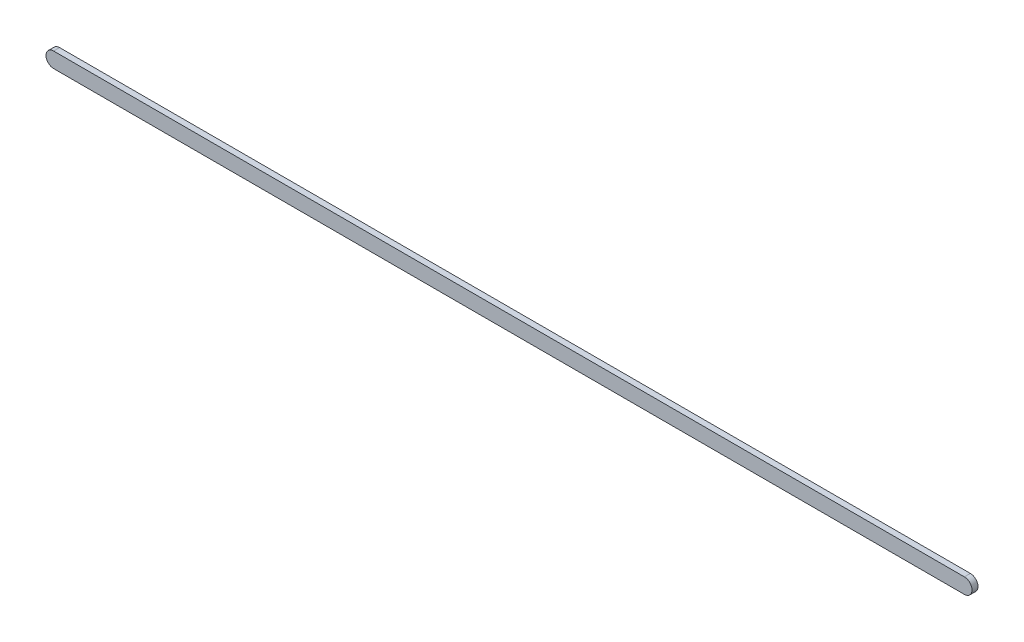
ISO-10303-21;
HEADER;
FILE_DESCRIPTION(('STEP AP214'),'2;1');
FILE_NAME('part.step','',(''),(''),'','','');
FILE_SCHEMA(('AUTOMOTIVE_DESIGN { 1 0 10303 214 1 1 1 1 }'));
ENDSEC;
DATA;
#1=APPLICATION_CONTEXT('core data for automotive mechanical design processes');
#2=APPLICATION_PROTOCOL_DEFINITION('international standard','automotive_design',2000,#1);
#3=PRODUCT_CONTEXT('',#1,'mechanical');
#4=PRODUCT('Part','Part','',(#3));
#5=PRODUCT_RELATED_PRODUCT_CATEGORY('part','',(#4));
#6=PRODUCT_DEFINITION_FORMATION('','',#4);
#7=PRODUCT_DEFINITION_CONTEXT('part definition',#1,'design');
#8=PRODUCT_DEFINITION('design','',#6,#7);
#9=PRODUCT_DEFINITION_SHAPE('','',#8);
#10=(LENGTH_UNIT() NAMED_UNIT(*) SI_UNIT(.MILLI.,.METRE.));
#11=(NAMED_UNIT(*) PLANE_ANGLE_UNIT() SI_UNIT($,.RADIAN.));
#12=(NAMED_UNIT(*) SI_UNIT($,.STERADIAN.) SOLID_ANGLE_UNIT());
#13=UNCERTAINTY_MEASURE_WITH_UNIT(LENGTH_MEASURE(1.E-05),#10,'distance_accuracy_value','');
#14=(GEOMETRIC_REPRESENTATION_CONTEXT(3) GLOBAL_UNCERTAINTY_ASSIGNED_CONTEXT((#13)) GLOBAL_UNIT_ASSIGNED_CONTEXT((#10,
#11,#12)) REPRESENTATION_CONTEXT('',''));
#15=CARTESIAN_POINT('',(0.,0.,0.));
#16=DIRECTION('',(0.,0.,1.));
#17=DIRECTION('',(1.,0.,0.));
#18=AXIS2_PLACEMENT_3D('',#15,#16,#17);
#19=CARTESIAN_POINT('',(105.921302,52.5272,0.));
#20=DIRECTION('',(0.,1.,0.));
#21=DIRECTION('',(1.,0.,0.));
#22=AXIS2_PLACEMENT_3D('',#19,#20,#21);
#23=PLANE('',#22);
#24=DIRECTION('',(1.,0.,0.));
#25=VECTOR('',#24,1.);
#26=CARTESIAN_POINT('',(105.921302,52.5272,0.1999996));
#27=LINE('',#26,#25);
#28=CARTESIAN_POINT('',(105.921302,52.5272,0.1999996));
#29=VERTEX_POINT('',#28);
#30=CARTESIAN_POINT('',(136.3472,52.5272,0.1999996));
#31=VERTEX_POINT('',#30);
#32=EDGE_CURVE('E11',#29,#31,#27,.T.);
#33=ORIENTED_EDGE('',*,*,#32,.F.);
#34=DIRECTION('',(0.,0.,1.));
#35=VECTOR('',#34,1.);
#36=CARTESIAN_POINT('',(105.921302,52.5272,0.));
#37=LINE('',#36,#35);
#38=CARTESIAN_POINT('',(105.921302,52.5272,0.));
#39=VERTEX_POINT('',#38);
#40=EDGE_CURVE('E24',#39,#29,#37,.T.);
#41=ORIENTED_EDGE('',*,*,#40,.F.);
#42=DIRECTION('',(1.,0.,0.));
#43=VECTOR('',#42,1.);
#44=CARTESIAN_POINT('',(105.921302,52.5272,0.));
#45=LINE('',#44,#43);
#46=CARTESIAN_POINT('',(136.3472,52.5272,0.));
#47=VERTEX_POINT('',#46);
#48=EDGE_CURVE('E75',#39,#47,#45,.T.);
#49=ORIENTED_EDGE('',*,*,#48,.T.);
#50=DIRECTION('',(0.,0.,1.));
#51=VECTOR('',#50,1.);
#52=CARTESIAN_POINT('',(136.3472,52.5272,0.));
#53=LINE('',#52,#51);
#54=EDGE_CURVE('E37',#47,#31,#53,.T.);
#55=ORIENTED_EDGE('',*,*,#54,.T.);
#56=EDGE_LOOP('',(#33,#41,#49,#55));
#57=FACE_BOUND('',#56,.T.);
#58=ADVANCED_FACE('F17',(#57),#23,.F.);
#59=CARTESIAN_POINT('',(136.3472,52.7812,0.));
#60=DIRECTION('',(0.,0.,-1.));
#61=DIRECTION('',(-1.11896493820489E-13,-1.,0.));
#62=AXIS2_PLACEMENT_3D('',#59,#60,#61);
#63=CYLINDRICAL_SURFACE('',#62,0.253999999999998);
#64=CARTESIAN_POINT('',(136.3472,52.7812,0.1999996));
#65=DIRECTION('',(0.,0.,1.));
#66=DIRECTION('',(-1.11896493820489E-13,-1.,0.));
#67=AXIS2_PLACEMENT_3D('',#64,#65,#66);
#68=CIRCLE('',#67,0.253999999999998);
#69=CARTESIAN_POINT('',(136.3472,53.0352,0.1999996));
#70=VERTEX_POINT('',#69);
#71=EDGE_CURVE('E83',#31,#70,#68,.T.);
#72=ORIENTED_EDGE('',*,*,#71,.F.);
#73=ORIENTED_EDGE('',*,*,#54,.F.);
#74=CARTESIAN_POINT('',(136.3472,52.7812,0.));
#75=DIRECTION('',(0.,0.,1.));
#76=DIRECTION('',(-1.11896493820489E-13,-1.,0.));
#77=AXIS2_PLACEMENT_3D('',#74,#75,#76);
#78=CIRCLE('',#77,0.253999999999998);
#79=CARTESIAN_POINT('',(136.3472,53.0352,0.));
#80=VERTEX_POINT('',#79);
#81=EDGE_CURVE('E81',#47,#80,#78,.T.);
#82=ORIENTED_EDGE('',*,*,#81,.T.);
#83=DIRECTION('',(0.,0.,1.));
#84=VECTOR('',#83,1.);
#85=CARTESIAN_POINT('',(136.3472,53.0352,0.));
#86=LINE('',#85,#84);
#87=EDGE_CURVE('E67',#80,#70,#86,.T.);
#88=ORIENTED_EDGE('',*,*,#87,.T.);
#89=EDGE_LOOP('',(#72,#73,#82,#88));
#90=FACE_BOUND('',#89,.T.);
#91=ADVANCED_FACE('F89',(#90),#63,.T.);
#92=CARTESIAN_POINT('',(136.3472,53.0352,0.));
#93=DIRECTION('',(0.,-1.,0.));
#94=DIRECTION('',(-1.,0.,0.));
#95=AXIS2_PLACEMENT_3D('',#92,#93,#94);
#96=PLANE('',#95);
#97=DIRECTION('',(-1.,0.,0.));
#98=VECTOR('',#97,1.);
#99=CARTESIAN_POINT('',(136.3472,53.0352,0.1999996));
#100=LINE('',#99,#98);
#101=CARTESIAN_POINT('',(105.921302,53.0352,0.1999996));
#102=VERTEX_POINT('',#101);
#103=EDGE_CURVE('E71',#70,#102,#100,.T.);
#104=ORIENTED_EDGE('',*,*,#103,.F.);
#105=ORIENTED_EDGE('',*,*,#87,.F.);
#106=DIRECTION('',(-1.,0.,0.));
#107=VECTOR('',#106,1.);
#108=CARTESIAN_POINT('',(136.3472,53.0352,0.));
#109=LINE('',#108,#107);
#110=CARTESIAN_POINT('',(105.921302,53.0352,0.));
#111=VERTEX_POINT('',#110);
#112=EDGE_CURVE('E63',#80,#111,#109,.T.);
#113=ORIENTED_EDGE('',*,*,#112,.T.);
#114=DIRECTION('',(0.,0.,1.));
#115=VECTOR('',#114,1.);
#116=CARTESIAN_POINT('',(105.921302,53.0352,0.));
#117=LINE('',#116,#115);
#118=EDGE_CURVE('E53',#111,#102,#117,.T.);
#119=ORIENTED_EDGE('',*,*,#118,.T.);
#120=EDGE_LOOP('',(#104,#105,#113,#119));
#121=FACE_BOUND('',#120,.T.);
#122=ADVANCED_FACE('F66',(#121),#96,.F.);
#123=CARTESIAN_POINT('',(105.921302,52.7812,0.));
#124=DIRECTION('',(0.,0.,-1.));
#125=DIRECTION('',(0.,1.,0.));
#126=AXIS2_PLACEMENT_3D('',#123,#124,#125);
#127=CYLINDRICAL_SURFACE('',#126,0.254000000000003);
#128=CARTESIAN_POINT('',(105.921302,52.7812,0.1999996));
#129=DIRECTION('',(0.,0.,1.));
#130=DIRECTION('',(0.,1.,0.));
#131=AXIS2_PLACEMENT_3D('',#128,#129,#130);
#132=CIRCLE('',#131,0.254000000000003);
#133=EDGE_CURVE('E59',#102,#29,#132,.T.);
#134=ORIENTED_EDGE('',*,*,#133,.F.);
#135=ORIENTED_EDGE('',*,*,#118,.F.);
#136=CARTESIAN_POINT('',(105.921302,52.7812,0.));
#137=DIRECTION('',(0.,0.,1.));
#138=DIRECTION('',(0.,1.,0.));
#139=AXIS2_PLACEMENT_3D('',#136,#137,#138);
#140=CIRCLE('',#139,0.254000000000003);
#141=EDGE_CURVE('E57',#111,#39,#140,.T.);
#142=ORIENTED_EDGE('',*,*,#141,.T.);
#143=ORIENTED_EDGE('',*,*,#40,.T.);
#144=EDGE_LOOP('',(#134,#135,#142,#143));
#145=FACE_BOUND('',#144,.T.);
#146=ADVANCED_FACE('F55',(#145),#127,.T.);
#147=CARTESIAN_POINT('',(105.921302,52.5272,0.));
#148=DIRECTION('',(0.,0.,-1.));
#149=DIRECTION('',(-1.,0.,0.));
#150=AXIS2_PLACEMENT_3D('',#147,#148,#149);
#151=PLANE('',#150);
#152=ORIENTED_EDGE('',*,*,#141,.F.);
#153=ORIENTED_EDGE('',*,*,#112,.F.);
#154=ORIENTED_EDGE('',*,*,#81,.F.);
#155=ORIENTED_EDGE('',*,*,#48,.F.);
#156=EDGE_LOOP('',(#152,#153,#154,#155));
#157=FACE_BOUND('',#156,.T.);
#158=ADVANCED_FACE('F74',(#157),#151,.T.);
#159=CARTESIAN_POINT('',(105.921302,52.5272,0.1999996));
#160=DIRECTION('',(0.,0.,-1.));
#161=DIRECTION('',(-1.,0.,0.));
#162=AXIS2_PLACEMENT_3D('',#159,#160,#161);
#163=PLANE('',#162);
#164=ORIENTED_EDGE('',*,*,#32,.T.);
#165=ORIENTED_EDGE('',*,*,#71,.T.);
#166=ORIENTED_EDGE('',*,*,#103,.T.);
#167=ORIENTED_EDGE('',*,*,#133,.T.);
#168=EDGE_LOOP('',(#164,#165,#166,#167));
#169=FACE_BOUND('',#168,.T.);
#170=ADVANCED_FACE('F91',(#169),#163,.F.);
#171=CLOSED_SHELL('',(#58,#91,#122,#146,#158,#170));
#172=MANIFOLD_SOLID_BREP('B1',#171);
#173=ADVANCED_BREP_SHAPE_REPRESENTATION('',(#18,#172),#14);
#174=SHAPE_DEFINITION_REPRESENTATION(#9,#173);
ENDSEC;
END-ISO-10303-21;
